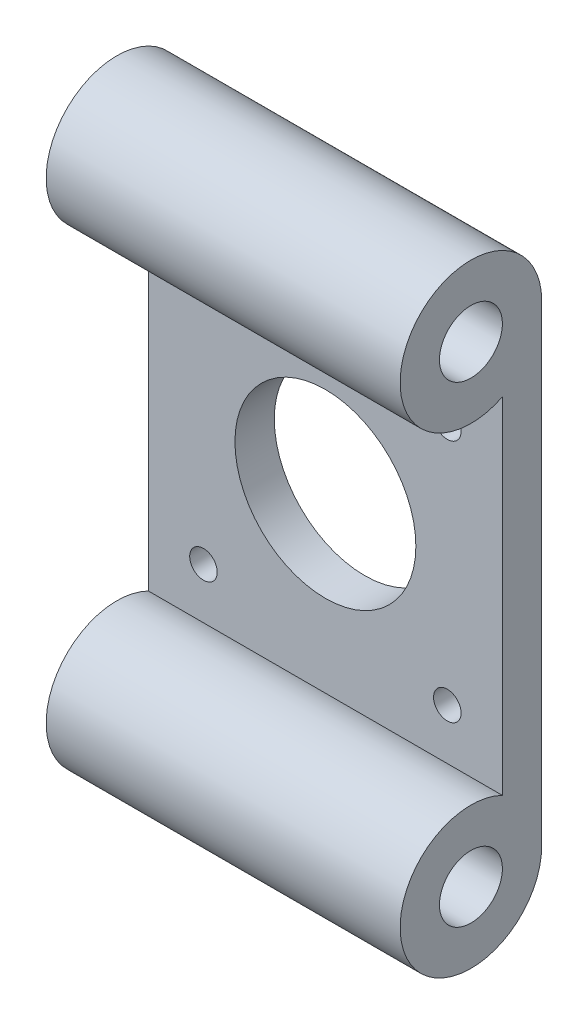
ISO-10303-21;
HEADER;
FILE_DESCRIPTION(('STEP AP214'),'2;1');
FILE_NAME('part.step','',(''),(''),'','','');
FILE_SCHEMA(('AUTOMOTIVE_DESIGN { 1 0 10303 214 1 1 1 1 }'));
ENDSEC;
DATA;
#1=APPLICATION_CONTEXT('core data for automotive mechanical design processes');
#2=APPLICATION_PROTOCOL_DEFINITION('international standard','automotive_design',2000,#1);
#3=PRODUCT_CONTEXT('',#1,'mechanical');
#4=PRODUCT('Part','Part','',(#3));
#5=PRODUCT_RELATED_PRODUCT_CATEGORY('part','',(#4));
#6=PRODUCT_DEFINITION_FORMATION('','',#4);
#7=PRODUCT_DEFINITION_CONTEXT('part definition',#1,'design');
#8=PRODUCT_DEFINITION('design','',#6,#7);
#9=PRODUCT_DEFINITION_SHAPE('','',#8);
#10=(LENGTH_UNIT() NAMED_UNIT(*) SI_UNIT(.MILLI.,.METRE.));
#11=(NAMED_UNIT(*) PLANE_ANGLE_UNIT() SI_UNIT($,.RADIAN.));
#12=(NAMED_UNIT(*) SI_UNIT($,.STERADIAN.) SOLID_ANGLE_UNIT());
#13=UNCERTAINTY_MEASURE_WITH_UNIT(LENGTH_MEASURE(1.E-05),#10,'distance_accuracy_value','');
#14=(GEOMETRIC_REPRESENTATION_CONTEXT(3) GLOBAL_UNCERTAINTY_ASSIGNED_CONTEXT((#13)) GLOBAL_UNIT_ASSIGNED_CONTEXT((#10,
#11,#12)) REPRESENTATION_CONTEXT('',''));
#15=CARTESIAN_POINT('',(0.,0.,0.));
#16=DIRECTION('',(0.,0.,1.));
#17=DIRECTION('',(1.,0.,0.));
#18=AXIS2_PLACEMENT_3D('',#15,#16,#17);
#19=CARTESIAN_POINT('',(0.,0.,5.));
#20=DIRECTION('',(0.,0.,1.));
#21=DIRECTION('',(1.,0.,0.));
#22=AXIS2_PLACEMENT_3D('',#19,#20,#21);
#23=PLANE('',#22);
#24=DIRECTION('',(-1.,0.,0.));
#25=VECTOR('',#24,1.);
#26=CARTESIAN_POINT('',(47.9558441227157,-21.9377422517014,5.));
#27=LINE('',#26,#25);
#28=CARTESIAN_POINT('',(22.5,-21.9377422517014,5.));
#29=VERTEX_POINT('',#28);
#30=CARTESIAN_POINT('',(-22.5,-21.9377422517015,5.));
#31=VERTEX_POINT('',#30);
#32=EDGE_CURVE('E74',#29,#31,#27,.T.);
#33=ORIENTED_EDGE('',*,*,#32,.F.);
#34=DIRECTION('',(0.,1.,0.));
#35=VECTOR('',#34,1.);
#36=CARTESIAN_POINT('',(22.5,22.5,5.));
#37=LINE('',#36,#35);
#38=CARTESIAN_POINT('',(22.5,21.9377422517015,5.));
#39=VERTEX_POINT('',#38);
#40=EDGE_CURVE('E42',#29,#39,#37,.T.);
#41=ORIENTED_EDGE('',*,*,#40,.T.);
#42=DIRECTION('',(-1.,0.,0.));
#43=VECTOR('',#42,1.);
#44=CARTESIAN_POINT('',(47.9558441227157,21.9377422517015,5.));
#45=LINE('',#44,#43);
#46=CARTESIAN_POINT('',(-22.5,21.9377422517014,5.));
#47=VERTEX_POINT('',#46);
#48=EDGE_CURVE('E53',#39,#47,#45,.T.);
#49=ORIENTED_EDGE('',*,*,#48,.T.);
#50=DIRECTION('',(0.,-1.,0.));
#51=VECTOR('',#50,1.);
#52=CARTESIAN_POINT('',(-22.5,22.5,5.));
#53=LINE('',#52,#51);
#54=EDGE_CURVE('E11',#47,#31,#53,.T.);
#55=ORIENTED_EDGE('',*,*,#54,.T.);
#56=EDGE_LOOP('',(#33,#41,#49,#55));
#57=FACE_BOUND('',#56,.T.);
#58=CARTESIAN_POINT('',(15.5000000000013,-15.4999999999996,5.));
#59=DIRECTION('',(0.,0.,1.));
#60=DIRECTION('',(1.,0.,0.));
#61=AXIS2_PLACEMENT_3D('',#58,#59,#60);
#62=CIRCLE('',#61,1.75);
#63=CARTESIAN_POINT('',(17.2500000000013,-15.4999999999996,5.));
#64=VERTEX_POINT('',#63);
#65=EDGE_CURVE('E98',#64,#64,#62,.T.);
#66=ORIENTED_EDGE('',*,*,#65,.F.);
#67=EDGE_LOOP('',(#66));
#68=FACE_BOUND('',#67,.T.);
#69=CARTESIAN_POINT('',(0.,0.,5.));
#70=DIRECTION('',(0.,0.,1.));
#71=DIRECTION('',(1.,0.,0.));
#72=AXIS2_PLACEMENT_3D('',#69,#70,#71);
#73=CIRCLE('',#72,11.5);
#74=CARTESIAN_POINT('',(11.5,0.,5.));
#75=VERTEX_POINT('',#74);
#76=EDGE_CURVE('E102',#75,#75,#73,.T.);
#77=ORIENTED_EDGE('',*,*,#76,.F.);
#78=EDGE_LOOP('',(#77));
#79=FACE_BOUND('',#78,.T.);
#80=CARTESIAN_POINT('',(-15.4999999999996,15.4999999999996,5.));
#81=DIRECTION('',(0.,0.,1.));
#82=DIRECTION('',(1.,0.,0.));
#83=AXIS2_PLACEMENT_3D('',#80,#81,#82);
#84=CIRCLE('',#83,1.75);
#85=CARTESIAN_POINT('',(-13.7499999999996,15.4999999999996,5.));
#86=VERTEX_POINT('',#85);
#87=EDGE_CURVE('E106',#86,#86,#84,.T.);
#88=ORIENTED_EDGE('',*,*,#87,.F.);
#89=EDGE_LOOP('',(#88));
#90=FACE_BOUND('',#89,.T.);
#91=CARTESIAN_POINT('',(15.5000000000004,15.5000000000004,5.));
#92=DIRECTION('',(0.,0.,1.));
#93=DIRECTION('',(1.,0.,0.));
#94=AXIS2_PLACEMENT_3D('',#91,#92,#93);
#95=CIRCLE('',#94,1.75);
#96=CARTESIAN_POINT('',(17.2500000000004,15.5000000000004,5.));
#97=VERTEX_POINT('',#96);
#98=EDGE_CURVE('E110',#97,#97,#95,.T.);
#99=ORIENTED_EDGE('',*,*,#98,.F.);
#100=EDGE_LOOP('',(#99));
#101=FACE_BOUND('',#100,.T.);
#102=CARTESIAN_POINT('',(-15.4999999999987,-15.5000000000004,5.));
#103=DIRECTION('',(0.,0.,1.));
#104=DIRECTION('',(1.,0.,0.));
#105=AXIS2_PLACEMENT_3D('',#102,#103,#104);
#106=CIRCLE('',#105,1.75);
#107=CARTESIAN_POINT('',(-13.7499999999987,-15.5000000000004,5.));
#108=VERTEX_POINT('',#107);
#109=EDGE_CURVE('E113',#108,#108,#106,.T.);
#110=ORIENTED_EDGE('',*,*,#109,.F.);
#111=EDGE_LOOP('',(#110));
#112=FACE_BOUND('',#111,.T.);
#113=ADVANCED_FACE('F33',(#57,#68,#79,#90,#101,#112),#23,.T.);
#114=CARTESIAN_POINT('',(0.,0.,0.));
#115=DIRECTION('',(0.,0.,1.));
#116=DIRECTION('',(1.,0.,0.));
#117=AXIS2_PLACEMENT_3D('',#114,#115,#116);
#118=PLANE('',#117);
#119=DIRECTION('',(-1.,0.,0.));
#120=VECTOR('',#119,1.);
#121=CARTESIAN_POINT('',(47.9558441227157,30.,0.));
#122=LINE('',#121,#120);
#123=CARTESIAN_POINT('',(22.5,30.,0.));
#124=VERTEX_POINT('',#123);
#125=CARTESIAN_POINT('',(-22.5,30.,0.));
#126=VERTEX_POINT('',#125);
#127=EDGE_CURVE('E149',#124,#126,#122,.T.);
#128=ORIENTED_EDGE('',*,*,#127,.F.);
#129=DIRECTION('',(0.,1.,0.));
#130=VECTOR('',#129,1.);
#131=CARTESIAN_POINT('',(22.5,22.5,0.));
#132=LINE('',#131,#130);
#133=CARTESIAN_POINT('',(22.5,-30.,0.));
#134=VERTEX_POINT('',#133);
#135=EDGE_CURVE('E137',#134,#124,#132,.T.);
#136=ORIENTED_EDGE('',*,*,#135,.F.);
#137=DIRECTION('',(-1.,0.,0.));
#138=VECTOR('',#137,1.);
#139=CARTESIAN_POINT('',(47.9558441227157,-30.,0.));
#140=LINE('',#139,#138);
#141=CARTESIAN_POINT('',(-22.5,-30.,0.));
#142=VERTEX_POINT('',#141);
#143=EDGE_CURVE('E81',#134,#142,#140,.T.);
#144=ORIENTED_EDGE('',*,*,#143,.T.);
#145=DIRECTION('',(0.,-1.,0.));
#146=VECTOR('',#145,1.);
#147=CARTESIAN_POINT('',(-22.5,22.5,0.));
#148=LINE('',#147,#146);
#149=EDGE_CURVE('E37',#126,#142,#148,.T.);
#150=ORIENTED_EDGE('',*,*,#149,.F.);
#151=EDGE_LOOP('',(#128,#136,#144,#150));
#152=FACE_BOUND('',#151,.T.);
#153=CARTESIAN_POINT('',(-15.4999999999996,15.4999999999996,0.));
#154=DIRECTION('',(0.,0.,1.));
#155=DIRECTION('',(1.,0.,0.));
#156=AXIS2_PLACEMENT_3D('',#153,#154,#155);
#157=CIRCLE('',#156,1.75);
#158=CARTESIAN_POINT('',(-13.7499999999996,15.4999999999996,0.));
#159=VERTEX_POINT('',#158);
#160=EDGE_CURVE('E133',#159,#159,#157,.T.);
#161=ORIENTED_EDGE('',*,*,#160,.T.);
#162=EDGE_LOOP('',(#161));
#163=FACE_BOUND('',#162,.T.);
#164=CARTESIAN_POINT('',(0.,0.,0.));
#165=DIRECTION('',(0.,0.,1.));
#166=DIRECTION('',(1.,0.,0.));
#167=AXIS2_PLACEMENT_3D('',#164,#165,#166);
#168=CIRCLE('',#167,11.5);
#169=CARTESIAN_POINT('',(11.5,0.,0.));
#170=VERTEX_POINT('',#169);
#171=EDGE_CURVE('E129',#170,#170,#168,.T.);
#172=ORIENTED_EDGE('',*,*,#171,.T.);
#173=EDGE_LOOP('',(#172));
#174=FACE_BOUND('',#173,.T.);
#175=CARTESIAN_POINT('',(15.5000000000004,15.5000000000004,0.));
#176=DIRECTION('',(0.,0.,1.));
#177=DIRECTION('',(1.,0.,0.));
#178=AXIS2_PLACEMENT_3D('',#175,#176,#177);
#179=CIRCLE('',#178,1.75);
#180=CARTESIAN_POINT('',(17.2500000000004,15.5000000000004,0.));
#181=VERTEX_POINT('',#180);
#182=EDGE_CURVE('E126',#181,#181,#179,.T.);
#183=ORIENTED_EDGE('',*,*,#182,.T.);
#184=EDGE_LOOP('',(#183));
#185=FACE_BOUND('',#184,.T.);
#186=CARTESIAN_POINT('',(15.5000000000013,-15.4999999999996,0.));
#187=DIRECTION('',(0.,0.,1.));
#188=DIRECTION('',(1.,0.,0.));
#189=AXIS2_PLACEMENT_3D('',#186,#187,#188);
#190=CIRCLE('',#189,1.75);
#191=CARTESIAN_POINT('',(17.2500000000013,-15.4999999999996,0.));
#192=VERTEX_POINT('',#191);
#193=EDGE_CURVE('E115',#192,#192,#190,.T.);
#194=ORIENTED_EDGE('',*,*,#193,.T.);
#195=EDGE_LOOP('',(#194));
#196=FACE_BOUND('',#195,.T.);
#197=CARTESIAN_POINT('',(-15.4999999999987,-15.5000000000004,0.));
#198=DIRECTION('',(0.,0.,1.));
#199=DIRECTION('',(1.,0.,0.));
#200=AXIS2_PLACEMENT_3D('',#197,#198,#199);
#201=CIRCLE('',#200,1.75);
#202=CARTESIAN_POINT('',(-13.7499999999987,-15.5000000000004,0.));
#203=VERTEX_POINT('',#202);
#204=EDGE_CURVE('E116',#203,#203,#201,.T.);
#205=ORIENTED_EDGE('',*,*,#204,.T.);
#206=EDGE_LOOP('',(#205));
#207=FACE_BOUND('',#206,.T.);
#208=ADVANCED_FACE('F93',(#152,#163,#174,#185,#196,#207),#118,.F.);
#209=CARTESIAN_POINT('',(22.5,22.5,5.));
#210=DIRECTION('',(-1.,0.,0.));
#211=DIRECTION('',(0.,-1.,0.));
#212=AXIS2_PLACEMENT_3D('',#209,#210,#211);
#213=PLANE('',#212);
#214=ORIENTED_EDGE('',*,*,#40,.F.);
#215=CARTESIAN_POINT('',(22.5,-30.,9.));
#216=DIRECTION('',(-1.,0.,0.));
#217=DIRECTION('',(0.,-1.,0.));
#218=AXIS2_PLACEMENT_3D('',#215,#216,#217);
#219=CIRCLE('',#218,9.);
#220=EDGE_CURVE('E80',#29,#134,#219,.F.);
#221=ORIENTED_EDGE('',*,*,#220,.T.);
#222=ORIENTED_EDGE('',*,*,#135,.T.);
#223=CARTESIAN_POINT('',(22.5,30.,9.));
#224=DIRECTION('',(-1.,0.,0.));
#225=DIRECTION('',(0.,-1.,0.));
#226=AXIS2_PLACEMENT_3D('',#223,#224,#225);
#227=CIRCLE('',#226,9.);
#228=EDGE_CURVE('E143',#124,#39,#227,.F.);
#229=ORIENTED_EDGE('',*,*,#228,.T.);
#230=EDGE_LOOP('',(#214,#221,#222,#229));
#231=FACE_BOUND('',#230,.T.);
#232=CARTESIAN_POINT('',(22.5,30.,9.));
#233=DIRECTION('',(-1.,0.,0.));
#234=DIRECTION('',(0.,-1.,0.));
#235=AXIS2_PLACEMENT_3D('',#232,#233,#234);
#236=CIRCLE('',#235,4.);
#237=CARTESIAN_POINT('',(22.5,26.,9.));
#238=VERTEX_POINT('',#237);
#239=EDGE_CURVE('E121',#238,#238,#236,.F.);
#240=ORIENTED_EDGE('',*,*,#239,.F.);
#241=EDGE_LOOP('',(#240));
#242=FACE_BOUND('',#241,.T.);
#243=CARTESIAN_POINT('',(22.5,-30.,9.));
#244=DIRECTION('',(-1.,0.,0.));
#245=DIRECTION('',(0.,-1.,0.));
#246=AXIS2_PLACEMENT_3D('',#243,#244,#245);
#247=CIRCLE('',#246,4.);
#248=CARTESIAN_POINT('',(22.5,-34.,9.));
#249=VERTEX_POINT('',#248);
#250=EDGE_CURVE('E158',#249,#249,#247,.F.);
#251=ORIENTED_EDGE('',*,*,#250,.F.);
#252=EDGE_LOOP('',(#251));
#253=FACE_BOUND('',#252,.T.);
#254=ADVANCED_FACE('F35',(#231,#242,#253),#213,.F.);
#255=CARTESIAN_POINT('',(-22.5,22.5,5.));
#256=DIRECTION('',(1.,0.,0.));
#257=DIRECTION('',(0.,1.,0.));
#258=AXIS2_PLACEMENT_3D('',#255,#256,#257);
#259=PLANE('',#258);
#260=CARTESIAN_POINT('',(-22.5,-30.,9.));
#261=DIRECTION('',(-1.,0.,0.));
#262=DIRECTION('',(0.,1.,0.));
#263=AXIS2_PLACEMENT_3D('',#260,#261,#262);
#264=CIRCLE('',#263,9.);
#265=EDGE_CURVE('E78',#142,#31,#264,.T.);
#266=ORIENTED_EDGE('',*,*,#265,.T.);
#267=ORIENTED_EDGE('',*,*,#54,.F.);
#268=CARTESIAN_POINT('',(-22.5,30.,9.));
#269=DIRECTION('',(-1.,0.,0.));
#270=DIRECTION('',(0.,-1.,0.));
#271=AXIS2_PLACEMENT_3D('',#268,#269,#270);
#272=CIRCLE('',#271,9.);
#273=EDGE_CURVE('E152',#47,#126,#272,.T.);
#274=ORIENTED_EDGE('',*,*,#273,.T.);
#275=ORIENTED_EDGE('',*,*,#149,.T.);
#276=EDGE_LOOP('',(#266,#267,#274,#275));
#277=FACE_BOUND('',#276,.T.);
#278=CARTESIAN_POINT('',(-22.5,30.,9.));
#279=DIRECTION('',(-1.,0.,0.));
#280=DIRECTION('',(0.,-1.,0.));
#281=AXIS2_PLACEMENT_3D('',#278,#279,#280);
#282=CIRCLE('',#281,4.);
#283=CARTESIAN_POINT('',(-22.5,26.,9.));
#284=VERTEX_POINT('',#283);
#285=EDGE_CURVE('E154',#284,#284,#282,.T.);
#286=ORIENTED_EDGE('',*,*,#285,.F.);
#287=EDGE_LOOP('',(#286));
#288=FACE_BOUND('',#287,.T.);
#289=CARTESIAN_POINT('',(-22.5,-30.,9.));
#290=DIRECTION('',(-1.,0.,0.));
#291=DIRECTION('',(0.,1.,0.));
#292=AXIS2_PLACEMENT_3D('',#289,#290,#291);
#293=CIRCLE('',#292,4.);
#294=CARTESIAN_POINT('',(-22.5,-26.,9.));
#295=VERTEX_POINT('',#294);
#296=EDGE_CURVE('E89',#295,#295,#293,.T.);
#297=ORIENTED_EDGE('',*,*,#296,.F.);
#298=EDGE_LOOP('',(#297));
#299=FACE_BOUND('',#298,.T.);
#300=ADVANCED_FACE('F84',(#277,#288,#299),#259,.F.);
#301=CARTESIAN_POINT('',(-15.4999999999996,15.4999999999996,5.));
#302=DIRECTION('',(0.,0.,-1.));
#303=DIRECTION('',(-1.,0.,0.));
#304=AXIS2_PLACEMENT_3D('',#301,#302,#303);
#305=CYLINDRICAL_SURFACE('',#304,1.75);
#306=ORIENTED_EDGE('',*,*,#87,.T.);
#307=EDGE_LOOP('',(#306));
#308=FACE_BOUND('',#307,.T.);
#309=ORIENTED_EDGE('',*,*,#160,.F.);
#310=EDGE_LOOP('',(#309));
#311=FACE_BOUND('',#310,.T.);
#312=ADVANCED_FACE('F170',(#308,#311),#305,.F.);
#313=CARTESIAN_POINT('',(0.,0.,5.));
#314=DIRECTION('',(0.,0.,-1.));
#315=DIRECTION('',(-1.,0.,0.));
#316=AXIS2_PLACEMENT_3D('',#313,#314,#315);
#317=CYLINDRICAL_SURFACE('',#316,11.5);
#318=ORIENTED_EDGE('',*,*,#76,.T.);
#319=EDGE_LOOP('',(#318));
#320=FACE_BOUND('',#319,.T.);
#321=ORIENTED_EDGE('',*,*,#171,.F.);
#322=EDGE_LOOP('',(#321));
#323=FACE_BOUND('',#322,.T.);
#324=ADVANCED_FACE('F176',(#320,#323),#317,.F.);
#325=CARTESIAN_POINT('',(15.5000000000004,15.5000000000004,5.));
#326=DIRECTION('',(0.,0.,-1.));
#327=DIRECTION('',(-1.,0.,0.));
#328=AXIS2_PLACEMENT_3D('',#325,#326,#327);
#329=CYLINDRICAL_SURFACE('',#328,1.75);
#330=ORIENTED_EDGE('',*,*,#98,.T.);
#331=EDGE_LOOP('',(#330));
#332=FACE_BOUND('',#331,.T.);
#333=ORIENTED_EDGE('',*,*,#182,.F.);
#334=EDGE_LOOP('',(#333));
#335=FACE_BOUND('',#334,.T.);
#336=ADVANCED_FACE('F184',(#332,#335),#329,.F.);
#337=CARTESIAN_POINT('',(15.5000000000013,-15.4999999999996,5.));
#338=DIRECTION('',(0.,0.,-1.));
#339=DIRECTION('',(-1.,0.,0.));
#340=AXIS2_PLACEMENT_3D('',#337,#338,#339);
#341=CYLINDRICAL_SURFACE('',#340,1.75);
#342=ORIENTED_EDGE('',*,*,#65,.T.);
#343=EDGE_LOOP('',(#342));
#344=FACE_BOUND('',#343,.T.);
#345=ORIENTED_EDGE('',*,*,#193,.F.);
#346=EDGE_LOOP('',(#345));
#347=FACE_BOUND('',#346,.T.);
#348=ADVANCED_FACE('F188',(#344,#347),#341,.F.);
#349=CARTESIAN_POINT('',(-15.4999999999987,-15.5000000000004,5.));
#350=DIRECTION('',(0.,0.,-1.));
#351=DIRECTION('',(-1.,0.,0.));
#352=AXIS2_PLACEMENT_3D('',#349,#350,#351);
#353=CYLINDRICAL_SURFACE('',#352,1.75);
#354=ORIENTED_EDGE('',*,*,#109,.T.);
#355=EDGE_LOOP('',(#354));
#356=FACE_BOUND('',#355,.T.);
#357=ORIENTED_EDGE('',*,*,#204,.F.);
#358=EDGE_LOOP('',(#357));
#359=FACE_BOUND('',#358,.T.);
#360=ADVANCED_FACE('F192',(#356,#359),#353,.F.);
#361=CARTESIAN_POINT('',(47.9558441227157,30.,9.));
#362=DIRECTION('',(-1.,0.,0.));
#363=DIRECTION('',(0.,-1.,0.));
#364=AXIS2_PLACEMENT_3D('',#361,#362,#363);
#365=CYLINDRICAL_SURFACE('',#364,9.);
#366=ORIENTED_EDGE('',*,*,#228,.F.);
#367=ORIENTED_EDGE('',*,*,#127,.T.);
#368=ORIENTED_EDGE('',*,*,#273,.F.);
#369=ORIENTED_EDGE('',*,*,#48,.F.);
#370=EDGE_LOOP('',(#366,#367,#368,#369));
#371=FACE_BOUND('',#370,.T.);
#372=ADVANCED_FACE('F148',(#371),#365,.T.);
#373=CARTESIAN_POINT('',(47.9558441227157,30.,9.));
#374=DIRECTION('',(-1.,0.,0.));
#375=DIRECTION('',(0.,-1.,0.));
#376=AXIS2_PLACEMENT_3D('',#373,#374,#375);
#377=CYLINDRICAL_SURFACE('',#376,4.);
#378=ORIENTED_EDGE('',*,*,#239,.T.);
#379=EDGE_LOOP('',(#378));
#380=FACE_BOUND('',#379,.T.);
#381=ORIENTED_EDGE('',*,*,#285,.T.);
#382=EDGE_LOOP('',(#381));
#383=FACE_BOUND('',#382,.T.);
#384=ADVANCED_FACE('F197',(#380,#383),#377,.F.);
#385=CARTESIAN_POINT('',(47.9558441227157,-30.,9.));
#386=DIRECTION('',(-1.,0.,0.));
#387=DIRECTION('',(0.,-1.,0.));
#388=AXIS2_PLACEMENT_3D('',#385,#386,#387);
#389=CYLINDRICAL_SURFACE('',#388,9.);
#390=ORIENTED_EDGE('',*,*,#220,.F.);
#391=ORIENTED_EDGE('',*,*,#32,.T.);
#392=ORIENTED_EDGE('',*,*,#265,.F.);
#393=ORIENTED_EDGE('',*,*,#143,.F.);
#394=EDGE_LOOP('',(#390,#391,#392,#393));
#395=FACE_BOUND('',#394,.T.);
#396=ADVANCED_FACE('F76',(#395),#389,.T.);
#397=CARTESIAN_POINT('',(47.9558441227157,-30.,9.));
#398=DIRECTION('',(-1.,0.,0.));
#399=DIRECTION('',(0.,-1.,0.));
#400=AXIS2_PLACEMENT_3D('',#397,#398,#399);
#401=CYLINDRICAL_SURFACE('',#400,4.);
#402=ORIENTED_EDGE('',*,*,#250,.T.);
#403=EDGE_LOOP('',(#402));
#404=FACE_BOUND('',#403,.T.);
#405=ORIENTED_EDGE('',*,*,#296,.T.);
#406=EDGE_LOOP('',(#405));
#407=FACE_BOUND('',#406,.T.);
#408=ADVANCED_FACE('F167',(#404,#407),#401,.F.);
#409=CLOSED_SHELL('',(#113,#208,#254,#300,#312,#324,#336,#348,#360,#372,#384,#396,#408));
#410=MANIFOLD_SOLID_BREP('B2',#409);
#411=ADVANCED_BREP_SHAPE_REPRESENTATION('',(#18,#410),#14);
#412=SHAPE_DEFINITION_REPRESENTATION(#9,#411);
ENDSEC;
END-ISO-10303-21;
